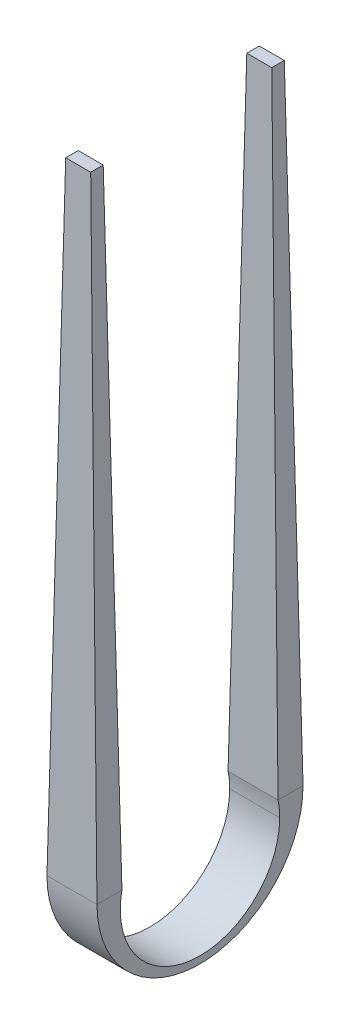
ISO-10303-21;
HEADER;
FILE_DESCRIPTION(('STEP AP214'),'2;1');
FILE_NAME('part.step','',(''),(''),'','','');
FILE_SCHEMA(('AUTOMOTIVE_DESIGN { 1 0 10303 214 1 1 1 1 }'));
ENDSEC;
DATA;
#1=APPLICATION_CONTEXT('core data for automotive mechanical design processes');
#2=APPLICATION_PROTOCOL_DEFINITION('international standard','automotive_design',2000,#1);
#3=PRODUCT_CONTEXT('',#1,'mechanical');
#4=PRODUCT('Part','Part','',(#3));
#5=PRODUCT_RELATED_PRODUCT_CATEGORY('part','',(#4));
#6=PRODUCT_DEFINITION_FORMATION('','',#4);
#7=PRODUCT_DEFINITION_CONTEXT('part definition',#1,'design');
#8=PRODUCT_DEFINITION('design','',#6,#7);
#9=PRODUCT_DEFINITION_SHAPE('','',#8);
#10=(LENGTH_UNIT() NAMED_UNIT(*) SI_UNIT(.MILLI.,.METRE.));
#11=(NAMED_UNIT(*) PLANE_ANGLE_UNIT() SI_UNIT($,.RADIAN.));
#12=(NAMED_UNIT(*) SI_UNIT($,.STERADIAN.) SOLID_ANGLE_UNIT());
#13=UNCERTAINTY_MEASURE_WITH_UNIT(LENGTH_MEASURE(1.E-05),#10,'distance_accuracy_value','');
#14=(GEOMETRIC_REPRESENTATION_CONTEXT(3) GLOBAL_UNCERTAINTY_ASSIGNED_CONTEXT((#13)) GLOBAL_UNIT_ASSIGNED_CONTEXT((#10,
#11,#12)) REPRESENTATION_CONTEXT('',''));
#15=CARTESIAN_POINT('',(0.,0.,0.));
#16=DIRECTION('',(0.,0.,1.));
#17=DIRECTION('',(1.,0.,0.));
#18=AXIS2_PLACEMENT_3D('',#15,#16,#17);
#19=CARTESIAN_POINT('',(-499.623511357238,100.779273283845,-175.030369401289));
#20=DIRECTION('',(-0.999800059980007,0.0199960011996001,0.));
#21=DIRECTION('',(0.,0.,1.));
#22=AXIS2_PLACEMENT_3D('',#19,#20,#21);
#23=PLANE('',#22);
#24=CARTESIAN_POINT('',(-499.623511357238,100.779273283845,-179.030369401289));
#25=CARTESIAN_POINT('',(-499.623511357238,100.779273283845,-177.697036067956));
#26=CARTESIAN_POINT('',(-499.623511357238,100.779273283845,-176.363702734623));
#27=CARTESIAN_POINT('',(-499.623511357238,100.779273283845,-175.030369401289));
#28=(BOUNDED_CURVE() B_SPLINE_CURVE(3,(#24,#25,#26,#27),.UNSPECIFIED.,.F.,
.F.) B_SPLINE_CURVE_WITH_KNOTS((4,4),(0.,1.),
.UNSPECIFIED.) CURVE() GEOMETRIC_REPRESENTATION_ITEM() RATIONAL_B_SPLINE_CURVE((1.,1.,1.,1.)) REPRESENTATION_ITEM(''));
#29=CARTESIAN_POINT('',(-499.623511357238,100.779273283845,-179.030369401289));
#30=VERTEX_POINT('',#29);
#31=CARTESIAN_POINT('',(-499.623511357238,100.779273283845,-175.030369401289));
#32=VERTEX_POINT('',#31);
#33=EDGE_CURVE('P0_E72',#30,#32,#28,.T.);
#34=ORIENTED_EDGE('',*,*,#33,.F.);
#35=CARTESIAN_POINT('',(-499.623511357238,100.779273283845,-179.030369401289));
#36=CARTESIAN_POINT('',(-500.956844690571,34.1126066171781,-179.697036067956));
#37=CARTESIAN_POINT('',(-502.290178023905,-32.5540600494886,-180.363702734622));
#38=CARTESIAN_POINT('',(-503.623511357238,-99.2207267161553,-181.030369401289));
#39=(BOUNDED_CURVE() B_SPLINE_CURVE(3,(#35,#36,#37,#38),.UNSPECIFIED.,.F.,
.F.) B_SPLINE_CURVE_WITH_KNOTS((4,4),(0.,1.),
.UNSPECIFIED.) CURVE() GEOMETRIC_REPRESENTATION_ITEM() RATIONAL_B_SPLINE_CURVE((1.,1.,1.,1.)) REPRESENTATION_ITEM(''));
#40=CARTESIAN_POINT('',(-503.623511357238,-99.2207267161553,-181.030369401289));
#41=VERTEX_POINT('',#40);
#42=EDGE_CURVE('P0_E11',#30,#41,#39,.T.);
#43=ORIENTED_EDGE('',*,*,#42,.T.);
#44=CARTESIAN_POINT('',(-503.623511357238,-99.2207267161553,-181.030369401289));
#45=CARTESIAN_POINT('',(-503.623511357238,-99.2207267161553,-178.363702734622));
#46=CARTESIAN_POINT('',(-503.623511357238,-99.2207267161553,-175.697036067956));
#47=CARTESIAN_POINT('',(-503.623511357238,-99.2207267161553,-173.030369401289));
#48=(BOUNDED_CURVE() B_SPLINE_CURVE(3,(#44,#45,#46,#47),.UNSPECIFIED.,.F.,
.F.) B_SPLINE_CURVE_WITH_KNOTS((4,4),(0.,1.),
.UNSPECIFIED.) CURVE() GEOMETRIC_REPRESENTATION_ITEM() RATIONAL_B_SPLINE_CURVE((1.,1.,1.,1.)) REPRESENTATION_ITEM(''));
#49=CARTESIAN_POINT('',(-503.623511357238,-99.2207267161553,-173.030369401289));
#50=VERTEX_POINT('',#49);
#51=EDGE_CURVE('P0_E69',#41,#50,#48,.T.);
#52=ORIENTED_EDGE('',*,*,#51,.T.);
#53=CARTESIAN_POINT('',(-499.623511357238,100.779273283845,-175.030369401289));
#54=CARTESIAN_POINT('',(-500.956844690571,34.1126066171781,-174.363702734623));
#55=CARTESIAN_POINT('',(-502.290178023904,-32.5540600494886,-173.697036067956));
#56=CARTESIAN_POINT('',(-503.623511357238,-99.2207267161553,-173.030369401289));
#57=(BOUNDED_CURVE() B_SPLINE_CURVE(3,(#53,#54,#55,#56),.UNSPECIFIED.,.F.,
.F.) B_SPLINE_CURVE_WITH_KNOTS((4,4),(0.,1.),
.UNSPECIFIED.) CURVE() GEOMETRIC_REPRESENTATION_ITEM() RATIONAL_B_SPLINE_CURVE((1.,1.,1.,1.)) REPRESENTATION_ITEM(''));
#58=EDGE_CURVE('P0_E116',#32,#50,#57,.T.);
#59=ORIENTED_EDGE('',*,*,#58,.F.);
#60=EDGE_LOOP('',(#34,#43,#52,#59));
#61=FACE_BOUND('',#60,.T.);
#62=ADVANCED_FACE('P0_F17',(#61),#23,.T.);
#63=CARTESIAN_POINT('',(-499.623511357238,100.779273283845,-179.030369401289));
#64=DIRECTION('',(0.,0.00999950003749688,-0.999950003749687));
#65=DIRECTION('',(-1.,0.,0.));
#66=AXIS2_PLACEMENT_3D('',#63,#64,#65);
#67=PLANE('',#66);
#68=CARTESIAN_POINT('',(-491.623511357238,100.779273283845,-179.030369401289));
#69=CARTESIAN_POINT('',(-494.290178023905,100.779273283845,-179.030369401289));
#70=CARTESIAN_POINT('',(-496.956844690571,100.779273283845,-179.030369401289));
#71=CARTESIAN_POINT('',(-499.623511357238,100.779273283845,-179.030369401289));
#72=(BOUNDED_CURVE() B_SPLINE_CURVE(3,(#68,#69,#70,#71),.UNSPECIFIED.,.F.,
.F.) B_SPLINE_CURVE_WITH_KNOTS((4,4),(0.,1.),
.UNSPECIFIED.) CURVE() GEOMETRIC_REPRESENTATION_ITEM() RATIONAL_B_SPLINE_CURVE((1.,1.,1.,1.)) REPRESENTATION_ITEM(''));
#73=CARTESIAN_POINT('',(-491.623511357238,100.779273283845,-179.030369401289));
#74=VERTEX_POINT('',#73);
#75=EDGE_CURVE('P0_E97',#74,#30,#72,.T.);
#76=ORIENTED_EDGE('',*,*,#75,.F.);
#77=CARTESIAN_POINT('',(-491.623511357238,100.779273283845,-179.030369401289));
#78=CARTESIAN_POINT('',(-490.290178023905,34.1126066171781,-179.697036067956));
#79=CARTESIAN_POINT('',(-488.956844690571,-32.5540600494886,-180.363702734622));
#80=CARTESIAN_POINT('',(-487.623511357238,-99.2207267161553,-181.030369401289));
#81=(BOUNDED_CURVE() B_SPLINE_CURVE(3,(#77,#78,#79,#80),.UNSPECIFIED.,.F.,
.F.) B_SPLINE_CURVE_WITH_KNOTS((4,4),(0.,1.),
.UNSPECIFIED.) CURVE() GEOMETRIC_REPRESENTATION_ITEM() RATIONAL_B_SPLINE_CURVE((1.,1.,1.,1.)) REPRESENTATION_ITEM(''));
#82=CARTESIAN_POINT('',(-487.623511357238,-99.2207267161553,-181.030369401289));
#83=VERTEX_POINT('',#82);
#84=EDGE_CURVE('P0_E30',#74,#83,#81,.T.);
#85=ORIENTED_EDGE('',*,*,#84,.T.);
#86=CARTESIAN_POINT('',(-487.623511357238,-99.2207267161553,-181.030369401289));
#87=CARTESIAN_POINT('',(-492.956844690571,-99.2207267161553,-181.030369401289));
#88=CARTESIAN_POINT('',(-498.290178023905,-99.2207267161553,-181.030369401289));
#89=CARTESIAN_POINT('',(-503.623511357238,-99.2207267161553,-181.030369401289));
#90=(BOUNDED_CURVE() B_SPLINE_CURVE(3,(#86,#87,#88,#89),.UNSPECIFIED.,.F.,
.F.) B_SPLINE_CURVE_WITH_KNOTS((4,4),(0.,1.),
.UNSPECIFIED.) CURVE() GEOMETRIC_REPRESENTATION_ITEM() RATIONAL_B_SPLINE_CURVE((1.,1.,1.,1.)) REPRESENTATION_ITEM(''));
#91=EDGE_CURVE('P0_E78',#83,#41,#90,.T.);
#92=ORIENTED_EDGE('',*,*,#91,.T.);
#93=ORIENTED_EDGE('',*,*,#42,.F.);
#94=EDGE_LOOP('',(#76,#85,#92,#93));
#95=FACE_BOUND('',#94,.T.);
#96=ADVANCED_FACE('P0_F84',(#95),#67,.T.);
#97=CARTESIAN_POINT('',(-491.623511357238,100.779273283845,-179.030369401289));
#98=DIRECTION('',(0.999800059980007,0.0199960011996003,0.));
#99=DIRECTION('',(0.,-6.96226258464213E-13,-1.));
#100=AXIS2_PLACEMENT_3D('',#97,#98,#99);
#101=PLANE('',#100);
#102=CARTESIAN_POINT('',(-491.623511357238,100.779273283845,-175.030369401289));
#103=CARTESIAN_POINT('',(-491.623511357238,100.779273283845,-176.363702734623));
#104=CARTESIAN_POINT('',(-491.623511357238,100.779273283845,-177.697036067956));
#105=CARTESIAN_POINT('',(-491.623511357238,100.779273283845,-179.030369401289));
#106=(BOUNDED_CURVE() B_SPLINE_CURVE(3,(#102,#103,#104,#105),.UNSPECIFIED.,.F.,
.F.) B_SPLINE_CURVE_WITH_KNOTS((4,4),(0.,1.),
.UNSPECIFIED.) CURVE() GEOMETRIC_REPRESENTATION_ITEM() RATIONAL_B_SPLINE_CURVE((1.,1.,1.,1.)) REPRESENTATION_ITEM(''));
#107=CARTESIAN_POINT('',(-491.623511357238,100.779273283845,-175.030369401289));
#108=VERTEX_POINT('',#107);
#109=EDGE_CURVE('P0_E101',#108,#74,#106,.T.);
#110=ORIENTED_EDGE('',*,*,#109,.F.);
#111=CARTESIAN_POINT('',(-491.623511357238,100.779273283845,-175.030369401289));
#112=CARTESIAN_POINT('',(-490.290178023905,34.1126066171781,-174.363702734623));
#113=CARTESIAN_POINT('',(-488.956844690571,-32.5540600494886,-173.697036067956));
#114=CARTESIAN_POINT('',(-487.623511357238,-99.2207267161553,-173.030369401289));
#115=(BOUNDED_CURVE() B_SPLINE_CURVE(3,(#111,#112,#113,#114),.UNSPECIFIED.,.F.,
.F.) B_SPLINE_CURVE_WITH_KNOTS((4,4),(0.,1.),
.UNSPECIFIED.) CURVE() GEOMETRIC_REPRESENTATION_ITEM() RATIONAL_B_SPLINE_CURVE((1.,1.,1.,1.)) REPRESENTATION_ITEM(''));
#116=CARTESIAN_POINT('',(-487.623511357238,-99.2207267161553,-173.030369401289));
#117=VERTEX_POINT('',#116);
#118=EDGE_CURVE('P0_E141',#108,#117,#115,.T.);
#119=ORIENTED_EDGE('',*,*,#118,.T.);
#120=CARTESIAN_POINT('',(-487.623511357238,-99.2207267161553,-173.030369401289));
#121=CARTESIAN_POINT('',(-487.623511357238,-99.2207267161553,-175.697036067956));
#122=CARTESIAN_POINT('',(-487.623511357238,-99.2207267161553,-178.363702734622));
#123=CARTESIAN_POINT('',(-487.623511357238,-99.2207267161553,-181.030369401289));
#124=(BOUNDED_CURVE() B_SPLINE_CURVE(3,(#120,#121,#122,#123),.UNSPECIFIED.,.F.,
.F.) B_SPLINE_CURVE_WITH_KNOTS((4,4),(0.,1.),
.UNSPECIFIED.) CURVE() GEOMETRIC_REPRESENTATION_ITEM() RATIONAL_B_SPLINE_CURVE((1.,1.,1.,1.)) REPRESENTATION_ITEM(''));
#125=EDGE_CURVE('P0_E21',#117,#83,#124,.T.);
#126=ORIENTED_EDGE('',*,*,#125,.T.);
#127=ORIENTED_EDGE('',*,*,#84,.F.);
#128=EDGE_LOOP('',(#110,#119,#126,#127));
#129=FACE_BOUND('',#128,.T.);
#130=ADVANCED_FACE('P0_F19',(#129),#101,.T.);
#131=CARTESIAN_POINT('',(-491.623511357238,100.779273283845,-175.030369401289));
#132=DIRECTION('',(0.,0.00999950003749688,0.999950003749687));
#133=DIRECTION('',(1.,-1.3923523122973E-12,0.));
#134=AXIS2_PLACEMENT_3D('',#131,#132,#133);
#135=PLANE('',#134);
#136=CARTESIAN_POINT('',(-499.623511357238,100.779273283845,-175.030369401289));
#137=CARTESIAN_POINT('',(-496.956844690571,100.779273283845,-175.030369401289));
#138=CARTESIAN_POINT('',(-494.290178023904,100.779273283845,-175.030369401289));
#139=CARTESIAN_POINT('',(-491.623511357238,100.779273283845,-175.030369401289));
#140=(BOUNDED_CURVE() B_SPLINE_CURVE(3,(#136,#137,#138,#139),.UNSPECIFIED.,.F.,
.F.) B_SPLINE_CURVE_WITH_KNOTS((4,4),(0.,1.),
.UNSPECIFIED.) CURVE() GEOMETRIC_REPRESENTATION_ITEM() RATIONAL_B_SPLINE_CURVE((1.,1.,1.,1.)) REPRESENTATION_ITEM(''));
#141=EDGE_CURVE('P0_E82',#32,#108,#140,.T.);
#142=ORIENTED_EDGE('',*,*,#141,.F.);
#143=ORIENTED_EDGE('',*,*,#58,.T.);
#144=CARTESIAN_POINT('',(-503.623511357238,-99.2207267161553,-173.030369401289));
#145=CARTESIAN_POINT('',(-498.290178023905,-99.2207267161553,-173.030369401289));
#146=CARTESIAN_POINT('',(-492.956844690571,-99.2207267161553,-173.030369401289));
#147=CARTESIAN_POINT('',(-487.623511357238,-99.2207267161553,-173.030369401289));
#148=(BOUNDED_CURVE() B_SPLINE_CURVE(3,(#144,#145,#146,#147),.UNSPECIFIED.,.F.,
.F.) B_SPLINE_CURVE_WITH_KNOTS((4,4),(0.,1.),
.UNSPECIFIED.) CURVE() GEOMETRIC_REPRESENTATION_ITEM() RATIONAL_B_SPLINE_CURVE((1.,1.,1.,1.)) REPRESENTATION_ITEM(''));
#149=EDGE_CURVE('P0_E80',#50,#117,#148,.T.);
#150=ORIENTED_EDGE('',*,*,#149,.T.);
#151=ORIENTED_EDGE('',*,*,#118,.F.);
#152=EDGE_LOOP('',(#142,#143,#150,#151));
#153=FACE_BOUND('',#152,.T.);
#154=ADVANCED_FACE('P0_F173',(#153),#135,.T.);
#155=CARTESIAN_POINT('',(-495.623511357238,100.779273283845,-177.030369401289));
#156=DIRECTION('',(0.,1.,0.));
#157=DIRECTION('',(1.,0.,0.));
#158=AXIS2_PLACEMENT_3D('',#155,#156,#157);
#159=PLANE('',#158);
#160=ORIENTED_EDGE('',*,*,#141,.T.);
#161=ORIENTED_EDGE('',*,*,#109,.T.);
#162=ORIENTED_EDGE('',*,*,#75,.T.);
#163=ORIENTED_EDGE('',*,*,#33,.T.);
#164=EDGE_LOOP('',(#160,#161,#162,#163));
#165=FACE_BOUND('',#164,.T.);
#166=ADVANCED_FACE('P0_F176',(#165),#159,.T.);
#167=CARTESIAN_POINT('',(-495.623511357238,-99.2207267161553,-177.030369401289));
#168=DIRECTION('',(0.,-1.,0.));
#169=DIRECTION('',(0.,0.,-1.));
#170=AXIS2_PLACEMENT_3D('',#167,#168,#169);
#171=PLANE('',#170);
#172=ORIENTED_EDGE('',*,*,#91,.F.);
#173=ORIENTED_EDGE('',*,*,#125,.F.);
#174=ORIENTED_EDGE('',*,*,#149,.F.);
#175=ORIENTED_EDGE('',*,*,#51,.F.);
#176=EDGE_LOOP('',(#172,#173,#174,#175));
#177=FACE_BOUND('',#176,.T.);
#178=ADVANCED_FACE('P0_F76',(#177),#171,.T.);
#179=CLOSED_SHELL('',(#62,#96,#130,#154,#166,#178));
#180=MANIFOLD_SOLID_BREP('P0_B1',#179);
#181=CARTESIAN_POINT('',(-491.623511357237,100.779273283845,-236.994601444059));
#182=DIRECTION('',(0.999800059980007,0.0199960011996002,0.));
#183=DIRECTION('',(0.,-3.49148133884313E-13,-1.));
#184=AXIS2_PLACEMENT_3D('',#181,#182,#183);
#185=PLANE('',#184);
#186=CARTESIAN_POINT('',(-491.623511357237,100.779273283845,-232.994601444059));
#187=CARTESIAN_POINT('',(-491.623511357237,100.779273283845,-234.327934777393));
#188=CARTESIAN_POINT('',(-491.623511357237,100.779273283845,-235.661268110727));
#189=CARTESIAN_POINT('',(-491.623511357237,100.779273283845,-236.994601444059));
#190=(BOUNDED_CURVE() B_SPLINE_CURVE(3,(#186,#187,#188,#189),.UNSPECIFIED.,.F.,
.F.) B_SPLINE_CURVE_WITH_KNOTS((4,4),(0.,1.),
.UNSPECIFIED.) CURVE() GEOMETRIC_REPRESENTATION_ITEM() RATIONAL_B_SPLINE_CURVE((1.,1.,1.,1.)) REPRESENTATION_ITEM(''));
#191=CARTESIAN_POINT('',(-491.623511357237,100.779273283845,-232.994601444059));
#192=VERTEX_POINT('',#191);
#193=CARTESIAN_POINT('',(-491.623511357237,100.779273283845,-236.994601444059));
#194=VERTEX_POINT('',#193);
#195=EDGE_CURVE('P1_E80',#192,#194,#190,.T.);
#196=ORIENTED_EDGE('',*,*,#195,.F.);
#197=CARTESIAN_POINT('',(-491.623511357237,100.779273283845,-232.994601444059));
#198=CARTESIAN_POINT('',(-490.290178023904,34.1126066171781,-232.327934777393));
#199=CARTESIAN_POINT('',(-488.95684469057,-32.5540600494886,-231.661268110727));
#200=CARTESIAN_POINT('',(-487.623511357237,-99.2207267161552,-230.994601444059));
#201=(BOUNDED_CURVE() B_SPLINE_CURVE(3,(#197,#198,#199,#200),.UNSPECIFIED.,.F.,
.F.) B_SPLINE_CURVE_WITH_KNOTS((4,4),(0.,1.),
.UNSPECIFIED.) CURVE() GEOMETRIC_REPRESENTATION_ITEM() RATIONAL_B_SPLINE_CURVE((1.,1.,1.,1.)) REPRESENTATION_ITEM(''));
#202=CARTESIAN_POINT('',(-487.623511357237,-99.2207267161552,-230.994601444059));
#203=VERTEX_POINT('',#202);
#204=EDGE_CURVE('P1_E11',#192,#203,#201,.T.);
#205=ORIENTED_EDGE('',*,*,#204,.T.);
#206=CARTESIAN_POINT('',(-487.623511357237,-99.2207267161552,-230.994601444059));
#207=CARTESIAN_POINT('',(-487.623511357237,-99.2207267161552,-233.661268110727));
#208=CARTESIAN_POINT('',(-487.623511357237,-99.2207267161552,-236.327934777393));
#209=CARTESIAN_POINT('',(-487.623511357237,-99.2207267161552,-238.99460144406));
#210=(BOUNDED_CURVE() B_SPLINE_CURVE(3,(#206,#207,#208,#209),.UNSPECIFIED.,.F.,
.F.) B_SPLINE_CURVE_WITH_KNOTS((4,4),(0.,1.),
.UNSPECIFIED.) CURVE() GEOMETRIC_REPRESENTATION_ITEM() RATIONAL_B_SPLINE_CURVE((1.,1.,1.,1.)) REPRESENTATION_ITEM(''));
#211=CARTESIAN_POINT('',(-487.623511357237,-99.2207267161552,-238.99460144406));
#212=VERTEX_POINT('',#211);
#213=EDGE_CURVE('P1_E83',#203,#212,#210,.T.);
#214=ORIENTED_EDGE('',*,*,#213,.T.);
#215=CARTESIAN_POINT('',(-491.623511357237,100.779273283845,-236.994601444059));
#216=CARTESIAN_POINT('',(-490.290178023904,34.1126066171781,-237.661268110727));
#217=CARTESIAN_POINT('',(-488.956844690571,-32.5540600494886,-238.327934777393));
#218=CARTESIAN_POINT('',(-487.623511357237,-99.2207267161552,-238.99460144406));
#219=(BOUNDED_CURVE() B_SPLINE_CURVE(3,(#215,#216,#217,#218),.UNSPECIFIED.,.F.,
.F.) B_SPLINE_CURVE_WITH_KNOTS((4,4),(0.,1.),
.UNSPECIFIED.) CURVE() GEOMETRIC_REPRESENTATION_ITEM() RATIONAL_B_SPLINE_CURVE((1.,1.,1.,1.)) REPRESENTATION_ITEM(''));
#220=EDGE_CURVE('P1_E67',#194,#212,#219,.T.);
#221=ORIENTED_EDGE('',*,*,#220,.F.);
#222=EDGE_LOOP('',(#196,#205,#214,#221));
#223=FACE_BOUND('',#222,.T.);
#224=ADVANCED_FACE('P1_F17',(#223),#185,.T.);
#225=CARTESIAN_POINT('',(-491.623511357237,100.779273283845,-232.994601444059));
#226=DIRECTION('',(0.,0.00999950003749688,0.999950003749687));
#227=DIRECTION('',(1.,-6.98296267768627E-13,0.));
#228=AXIS2_PLACEMENT_3D('',#225,#226,#227);
#229=PLANE('',#228);
#230=CARTESIAN_POINT('',(-499.623511357237,100.779273283845,-232.994601444059));
#231=CARTESIAN_POINT('',(-496.956844690571,100.779273283845,-232.994601444059));
#232=CARTESIAN_POINT('',(-494.290178023904,100.779273283845,-232.994601444059));
#233=CARTESIAN_POINT('',(-491.623511357237,100.779273283845,-232.994601444059));
#234=(BOUNDED_CURVE() B_SPLINE_CURVE(3,(#230,#231,#232,#233),.UNSPECIFIED.,.F.,
.F.) B_SPLINE_CURVE_WITH_KNOTS((4,4),(0.,1.),
.UNSPECIFIED.) CURVE() GEOMETRIC_REPRESENTATION_ITEM() RATIONAL_B_SPLINE_CURVE((1.,1.,1.,1.)) REPRESENTATION_ITEM(''));
#235=CARTESIAN_POINT('',(-499.623511357237,100.779273283845,-232.994601444059));
#236=VERTEX_POINT('',#235);
#237=EDGE_CURVE('P1_E104',#236,#192,#234,.T.);
#238=ORIENTED_EDGE('',*,*,#237,.F.);
#239=CARTESIAN_POINT('',(-499.623511357237,100.779273283845,-232.994601444059));
#240=CARTESIAN_POINT('',(-500.95684469057,34.1126066171781,-232.327934777393));
#241=CARTESIAN_POINT('',(-502.290178023904,-32.5540600494886,-231.661268110727));
#242=CARTESIAN_POINT('',(-503.623511357237,-99.2207267161552,-230.994601444059));
#243=(BOUNDED_CURVE() B_SPLINE_CURVE(3,(#239,#240,#241,#242),.UNSPECIFIED.,.F.,
.F.) B_SPLINE_CURVE_WITH_KNOTS((4,4),(0.,1.),
.UNSPECIFIED.) CURVE() GEOMETRIC_REPRESENTATION_ITEM() RATIONAL_B_SPLINE_CURVE((1.,1.,1.,1.)) REPRESENTATION_ITEM(''));
#244=CARTESIAN_POINT('',(-503.623511357237,-99.2207267161552,-230.994601444059));
#245=VERTEX_POINT('',#244);
#246=EDGE_CURVE('P1_E21',#236,#245,#243,.T.);
#247=ORIENTED_EDGE('',*,*,#246,.T.);
#248=CARTESIAN_POINT('',(-503.623511357237,-99.2207267161552,-230.994601444059));
#249=CARTESIAN_POINT('',(-498.290178023904,-99.2207267161553,-230.994601444059));
#250=CARTESIAN_POINT('',(-492.956844690571,-99.2207267161553,-230.994601444059));
#251=CARTESIAN_POINT('',(-487.623511357237,-99.2207267161552,-230.994601444059));
#252=(BOUNDED_CURVE() B_SPLINE_CURVE(3,(#248,#249,#250,#251),.UNSPECIFIED.,.F.,
.F.) B_SPLINE_CURVE_WITH_KNOTS((4,4),(0.,1.),
.UNSPECIFIED.) CURVE() GEOMETRIC_REPRESENTATION_ITEM() RATIONAL_B_SPLINE_CURVE((1.,1.,1.,1.)) REPRESENTATION_ITEM(''));
#253=EDGE_CURVE('P1_E98',#245,#203,#252,.T.);
#254=ORIENTED_EDGE('',*,*,#253,.T.);
#255=ORIENTED_EDGE('',*,*,#204,.F.);
#256=EDGE_LOOP('',(#238,#247,#254,#255));
#257=FACE_BOUND('',#256,.T.);
#258=ADVANCED_FACE('P1_F156',(#257),#229,.T.);
#259=CARTESIAN_POINT('',(-499.623511357237,100.779273283845,-232.994601444059));
#260=DIRECTION('',(-0.999800059980007,0.0199960011996002,0.));
#261=DIRECTION('',(0.,0.,1.));
#262=AXIS2_PLACEMENT_3D('',#259,#260,#261);
#263=PLANE('',#262);
#264=CARTESIAN_POINT('',(-499.623511357237,100.779273283845,-236.994601444059));
#265=CARTESIAN_POINT('',(-499.623511357237,100.779273283845,-235.661268110727));
#266=CARTESIAN_POINT('',(-499.623511357237,100.779273283845,-234.327934777393));
#267=CARTESIAN_POINT('',(-499.623511357237,100.779273283845,-232.994601444059));
#268=(BOUNDED_CURVE() B_SPLINE_CURVE(3,(#264,#265,#266,#267),.UNSPECIFIED.,.F.,
.F.) B_SPLINE_CURVE_WITH_KNOTS((4,4),(0.,1.),
.UNSPECIFIED.) CURVE() GEOMETRIC_REPRESENTATION_ITEM() RATIONAL_B_SPLINE_CURVE((1.,1.,1.,1.)) REPRESENTATION_ITEM(''));
#269=CARTESIAN_POINT('',(-499.623511357237,100.779273283845,-236.994601444059));
#270=VERTEX_POINT('',#269);
#271=EDGE_CURVE('P1_E113',#270,#236,#268,.T.);
#272=ORIENTED_EDGE('',*,*,#271,.F.);
#273=CARTESIAN_POINT('',(-499.623511357237,100.779273283845,-236.994601444059));
#274=CARTESIAN_POINT('',(-500.95684469057,34.1126066171781,-237.661268110727));
#275=CARTESIAN_POINT('',(-502.290178023904,-32.5540600494886,-238.327934777393));
#276=CARTESIAN_POINT('',(-503.623511357237,-99.2207267161552,-238.99460144406));
#277=(BOUNDED_CURVE() B_SPLINE_CURVE(3,(#273,#274,#275,#276),.UNSPECIFIED.,.F.,
.F.) B_SPLINE_CURVE_WITH_KNOTS((4,4),(0.,1.),
.UNSPECIFIED.) CURVE() GEOMETRIC_REPRESENTATION_ITEM() RATIONAL_B_SPLINE_CURVE((1.,1.,1.,1.)) REPRESENTATION_ITEM(''));
#278=CARTESIAN_POINT('',(-503.623511357237,-99.2207267161552,-238.99460144406));
#279=VERTEX_POINT('',#278);
#280=EDGE_CURVE('P1_E79',#270,#279,#277,.T.);
#281=ORIENTED_EDGE('',*,*,#280,.T.);
#282=CARTESIAN_POINT('',(-503.623511357237,-99.2207267161552,-238.99460144406));
#283=CARTESIAN_POINT('',(-503.623511357237,-99.2207267161552,-236.327934777393));
#284=CARTESIAN_POINT('',(-503.623511357237,-99.2207267161552,-233.661268110727));
#285=CARTESIAN_POINT('',(-503.623511357237,-99.2207267161552,-230.994601444059));
#286=(BOUNDED_CURVE() B_SPLINE_CURVE(3,(#282,#283,#284,#285),.UNSPECIFIED.,.F.,
.F.) B_SPLINE_CURVE_WITH_KNOTS((4,4),(0.,1.),
.UNSPECIFIED.) CURVE() GEOMETRIC_REPRESENTATION_ITEM() RATIONAL_B_SPLINE_CURVE((1.,1.,1.,1.)) REPRESENTATION_ITEM(''));
#287=EDGE_CURVE('P1_E90',#279,#245,#286,.T.);
#288=ORIENTED_EDGE('',*,*,#287,.T.);
#289=ORIENTED_EDGE('',*,*,#246,.F.);
#290=EDGE_LOOP('',(#272,#281,#288,#289));
#291=FACE_BOUND('',#290,.T.);
#292=ADVANCED_FACE('P1_F158',(#291),#263,.T.);
#293=CARTESIAN_POINT('',(-499.623511357237,100.779273283845,-236.994601444059));
#294=DIRECTION('',(0.,0.00999950003749688,-0.999950003749687));
#295=DIRECTION('',(-1.,0.,0.));
#296=AXIS2_PLACEMENT_3D('',#293,#294,#295);
#297=PLANE('',#296);
#298=CARTESIAN_POINT('',(-491.623511357237,100.779273283845,-236.994601444059));
#299=CARTESIAN_POINT('',(-494.290178023904,100.779273283845,-236.994601444059));
#300=CARTESIAN_POINT('',(-496.956844690571,100.779273283845,-236.994601444059));
#301=CARTESIAN_POINT('',(-499.623511357237,100.779273283845,-236.994601444059));
#302=(BOUNDED_CURVE() B_SPLINE_CURVE(3,(#298,#299,#300,#301),.UNSPECIFIED.,.F.,
.F.) B_SPLINE_CURVE_WITH_KNOTS((4,4),(0.,1.),
.UNSPECIFIED.) CURVE() GEOMETRIC_REPRESENTATION_ITEM() RATIONAL_B_SPLINE_CURVE((1.,1.,1.,1.)) REPRESENTATION_ITEM(''));
#303=EDGE_CURVE('P1_E75',#194,#270,#302,.T.);
#304=ORIENTED_EDGE('',*,*,#303,.F.);
#305=ORIENTED_EDGE('',*,*,#220,.T.);
#306=CARTESIAN_POINT('',(-487.623511357237,-99.2207267161552,-238.99460144406));
#307=CARTESIAN_POINT('',(-492.956844690571,-99.2207267161553,-238.99460144406));
#308=CARTESIAN_POINT('',(-498.290178023904,-99.2207267161553,-238.99460144406));
#309=CARTESIAN_POINT('',(-503.623511357237,-99.2207267161552,-238.99460144406));
#310=(BOUNDED_CURVE() B_SPLINE_CURVE(3,(#306,#307,#308,#309),.UNSPECIFIED.,.F.,
.F.) B_SPLINE_CURVE_WITH_KNOTS((4,4),(0.,1.),
.UNSPECIFIED.) CURVE() GEOMETRIC_REPRESENTATION_ITEM() RATIONAL_B_SPLINE_CURVE((1.,1.,1.,1.)) REPRESENTATION_ITEM(''));
#311=EDGE_CURVE('P1_E72',#212,#279,#310,.T.);
#312=ORIENTED_EDGE('',*,*,#311,.T.);
#313=ORIENTED_EDGE('',*,*,#280,.F.);
#314=EDGE_LOOP('',(#304,#305,#312,#313));
#315=FACE_BOUND('',#314,.T.);
#316=ADVANCED_FACE('P1_F69',(#315),#297,.T.);
#317=CARTESIAN_POINT('',(-495.623511357237,100.779273283845,-234.994601444059));
#318=DIRECTION('',(0.,1.,0.));
#319=DIRECTION('',(1.,0.,0.));
#320=AXIS2_PLACEMENT_3D('',#317,#318,#319);
#321=PLANE('',#320);
#322=ORIENTED_EDGE('',*,*,#303,.T.);
#323=ORIENTED_EDGE('',*,*,#271,.T.);
#324=ORIENTED_EDGE('',*,*,#237,.T.);
#325=ORIENTED_EDGE('',*,*,#195,.T.);
#326=EDGE_LOOP('',(#322,#323,#324,#325));
#327=FACE_BOUND('',#326,.T.);
#328=ADVANCED_FACE('P1_F19',(#327),#321,.T.);
#329=CARTESIAN_POINT('',(-495.623511357237,-99.2207267161552,-234.994601444059));
#330=DIRECTION('',(0.,-1.,0.));
#331=DIRECTION('',(0.,0.,-1.));
#332=AXIS2_PLACEMENT_3D('',#329,#330,#331);
#333=PLANE('',#332);
#334=ORIENTED_EDGE('',*,*,#253,.F.);
#335=ORIENTED_EDGE('',*,*,#287,.F.);
#336=ORIENTED_EDGE('',*,*,#311,.F.);
#337=ORIENTED_EDGE('',*,*,#213,.F.);
#338=EDGE_LOOP('',(#334,#335,#336,#337));
#339=FACE_BOUND('',#338,.T.);
#340=ADVANCED_FACE('P1_F88',(#339),#333,.T.);
#341=CLOSED_SHELL('',(#224,#258,#292,#316,#328,#340));
#342=MANIFOLD_SOLID_BREP('P1_B1',#341);
#343=CARTESIAN_POINT('',(-503.623511357237,395.59718436808,-247.928630501101));
#344=DIRECTION('',(1.,0.,0.));
#345=DIRECTION('',(0.,0.,-1.));
#346=AXIS2_PLACEMENT_3D('',#343,#344,#345);
#347=PLANE('',#346);
#348=DIRECTION('',(0.,0.,-1.));
#349=VECTOR('',#348,1.);
#350=CARTESIAN_POINT('',(-503.623511357237,-99.2207267161553,-247.928630501101));
#351=LINE('',#350,#349);
#352=CARTESIAN_POINT('',(-503.623511357237,-99.2207267161552,-173.030369401292));
#353=VERTEX_POINT('',#352);
#354=CARTESIAN_POINT('',(-503.623511357237,-99.2207267161553,-181.030369401289));
#355=VERTEX_POINT('',#354);
#356=EDGE_CURVE('P2_E105',#353,#355,#351,.T.);
#357=ORIENTED_EDGE('',*,*,#356,.T.);
#358=CARTESIAN_POINT('',(-503.623511357237,-104.419504194432,-206.012485422675));
#359=DIRECTION('',(1.,0.,0.));
#360=DIRECTION('',(0.,0.,-1.));
#361=AXIS2_PLACEMENT_3D('',#358,#359,#360);
#362=CIRCLE('',#361,25.5173158497243);
#363=CARTESIAN_POINT('',(-503.623511357237,-104.419504194432,-180.49516957295));
#364=VERTEX_POINT('',#363);
#365=EDGE_CURVE('P2_E133',#355,#364,#362,.T.);
#366=ORIENTED_EDGE('',*,*,#365,.T.);
#367=CARTESIAN_POINT('',(-503.623511357237,-104.419504194432,-206.012485422675));
#368=DIRECTION('',(1.,0.,0.));
#369=DIRECTION('',(0.,0.,-1.));
#370=AXIS2_PLACEMENT_3D('',#367,#368,#369);
#371=CIRCLE('',#370,25.5173158497243);
#372=CARTESIAN_POINT('',(-503.623511357237,-104.419504194432,-231.529801272398));
#373=VERTEX_POINT('',#372);
#374=EDGE_CURVE('P2_E120',#364,#373,#371,.T.);
#375=ORIENTED_EDGE('',*,*,#374,.T.);
#376=CARTESIAN_POINT('',(-503.623511357237,-104.419504194432,-206.012485422675));
#377=DIRECTION('',(1.,0.,0.));
#378=DIRECTION('',(0.,0.,-1.));
#379=AXIS2_PLACEMENT_3D('',#376,#377,#378);
#380=CIRCLE('',#379,25.5173158497243);
#381=CARTESIAN_POINT('',(-503.623511357237,-99.2207267161553,-230.994601444059));
#382=VERTEX_POINT('',#381);
#383=EDGE_CURVE('P2_E10',#373,#382,#380,.T.);
#384=ORIENTED_EDGE('',*,*,#383,.T.);
#385=DIRECTION('',(0.,0.,-1.));
#386=VECTOR('',#385,1.);
#387=CARTESIAN_POINT('',(-503.623511357237,-99.2207267161553,-247.928630501101));
#388=LINE('',#387,#386);
#389=CARTESIAN_POINT('',(-503.623511357237,-99.2207267161552,-238.99460144406));
#390=VERTEX_POINT('',#389);
#391=EDGE_CURVE('P2_E72',#382,#390,#388,.T.);
#392=ORIENTED_EDGE('',*,*,#391,.T.);
#393=CARTESIAN_POINT('',(-503.623511357237,-99.2207267161552,-206.012485422676));
#394=DIRECTION('',(1.,0.,0.));
#395=DIRECTION('',(0.,0.,-1.));
#396=AXIS2_PLACEMENT_3D('',#393,#394,#395);
#397=CIRCLE('',#396,32.9821160213835);
#398=EDGE_CURVE('P2_E75',#353,#390,#397,.T.);
#399=ORIENTED_EDGE('',*,*,#398,.F.);
#400=EDGE_LOOP('',(#357,#366,#375,#384,#392,#399));
#401=FACE_BOUND('',#400,.T.);
#402=ADVANCED_FACE('P2_F16',(#401),#347,.F.);
#403=CARTESIAN_POINT('',(-487.623511357237,395.59718436808,-247.928630501101));
#404=DIRECTION('',(1.,0.,0.));
#405=DIRECTION('',(0.,0.,-1.));
#406=AXIS2_PLACEMENT_3D('',#403,#404,#405);
#407=PLANE('',#406);
#408=DIRECTION('',(0.,0.,-1.));
#409=VECTOR('',#408,1.);
#410=CARTESIAN_POINT('',(-487.623511357237,-99.2207267161553,-247.928630501101));
#411=LINE('',#410,#409);
#412=CARTESIAN_POINT('',(-487.623511357237,-99.2207267161552,-173.030369401292));
#413=VERTEX_POINT('',#412);
#414=CARTESIAN_POINT('',(-487.623511357237,-99.2207267161553,-181.030369401289));
#415=VERTEX_POINT('',#414);
#416=EDGE_CURVE('P2_E97',#413,#415,#411,.T.);
#417=ORIENTED_EDGE('',*,*,#416,.F.);
#418=CARTESIAN_POINT('',(-487.623511357237,-99.2207267161552,-206.012485422676));
#419=DIRECTION('',(1.,0.,0.));
#420=DIRECTION('',(0.,0.,-1.));
#421=AXIS2_PLACEMENT_3D('',#418,#419,#420);
#422=CIRCLE('',#421,32.9821160213835);
#423=CARTESIAN_POINT('',(-487.623511357237,-99.2207267161552,-238.99460144406));
#424=VERTEX_POINT('',#423);
#425=EDGE_CURVE('P2_E82',#413,#424,#422,.T.);
#426=ORIENTED_EDGE('',*,*,#425,.T.);
#427=DIRECTION('',(0.,0.,-1.));
#428=VECTOR('',#427,1.);
#429=CARTESIAN_POINT('',(-487.623511357237,-99.2207267161553,-247.928630501101));
#430=LINE('',#429,#428);
#431=CARTESIAN_POINT('',(-487.623511357237,-99.2207267161553,-230.994601444059));
#432=VERTEX_POINT('',#431);
#433=EDGE_CURVE('P2_E87',#432,#424,#430,.T.);
#434=ORIENTED_EDGE('',*,*,#433,.F.);
#435=CARTESIAN_POINT('',(-487.623511357237,-104.419504194432,-206.012485422675));
#436=DIRECTION('',(1.,0.,0.));
#437=DIRECTION('',(0.,0.,-1.));
#438=AXIS2_PLACEMENT_3D('',#435,#436,#437);
#439=CIRCLE('',#438,25.5173158497243);
#440=CARTESIAN_POINT('',(-487.623511357237,-104.419504194432,-231.529801272399));
#441=VERTEX_POINT('',#440);
#442=EDGE_CURVE('P2_E25',#441,#432,#439,.T.);
#443=ORIENTED_EDGE('',*,*,#442,.F.);
#444=CARTESIAN_POINT('',(-487.623511357237,-104.419504194432,-206.012485422675));
#445=DIRECTION('',(1.,0.,0.));
#446=DIRECTION('',(0.,0.,-1.));
#447=AXIS2_PLACEMENT_3D('',#444,#445,#446);
#448=CIRCLE('',#447,25.5173158497243);
#449=CARTESIAN_POINT('',(-487.623511357237,-104.419504194432,-180.49516957295));
#450=VERTEX_POINT('',#449);
#451=EDGE_CURVE('P2_E108',#450,#441,#448,.T.);
#452=ORIENTED_EDGE('',*,*,#451,.F.);
#453=CARTESIAN_POINT('',(-487.623511357237,-104.419504194432,-206.012485422675));
#454=DIRECTION('',(1.,0.,0.));
#455=DIRECTION('',(0.,0.,-1.));
#456=AXIS2_PLACEMENT_3D('',#453,#454,#455);
#457=CIRCLE('',#456,25.5173158497243);
#458=EDGE_CURVE('P2_E119',#415,#450,#457,.T.);
#459=ORIENTED_EDGE('',*,*,#458,.F.);
#460=EDGE_LOOP('',(#417,#426,#434,#443,#452,#459));
#461=FACE_BOUND('',#460,.T.);
#462=ADVANCED_FACE('P2_F169',(#461),#407,.T.);
#463=CARTESIAN_POINT('',(-487.623511357237,-104.419504194432,-206.012485422675));
#464=DIRECTION('',(-1.,0.,0.));
#465=DIRECTION('',(0.,0.,1.));
#466=AXIS2_PLACEMENT_3D('',#463,#464,#465);
#467=CYLINDRICAL_SURFACE('',#466,25.5173158497243);
#468=DIRECTION('',(-1.,0.,0.));
#469=VECTOR('',#468,1.);
#470=CARTESIAN_POINT('',(-487.623511357237,-104.419504194432,-231.529801272399));
#471=LINE('',#470,#469);
#472=EDGE_CURVE('P2_E111',#441,#373,#471,.T.);
#473=ORIENTED_EDGE('',*,*,#472,.F.);
#474=ORIENTED_EDGE('',*,*,#442,.T.);
#475=DIRECTION('',(-1.,0.,0.));
#476=VECTOR('',#475,1.);
#477=CARTESIAN_POINT('',(-487.623511357237,-99.2207267161553,-230.994601444059));
#478=LINE('',#477,#476);
#479=EDGE_CURVE('P2_E81',#432,#382,#478,.T.);
#480=ORIENTED_EDGE('',*,*,#479,.T.);
#481=ORIENTED_EDGE('',*,*,#383,.F.);
#482=EDGE_LOOP('',(#473,#474,#480,#481));
#483=FACE_BOUND('',#482,.T.);
#484=ADVANCED_FACE('P2_F170',(#483),#467,.F.);
#485=CARTESIAN_POINT('',(-487.623511357237,-99.2207267161553,-247.928630501101));
#486=DIRECTION('',(0.,1.,0.));
#487=DIRECTION('',(1.,0.,0.));
#488=AXIS2_PLACEMENT_3D('',#485,#486,#487);
#489=PLANE('',#488);
#490=ORIENTED_EDGE('',*,*,#391,.F.);
#491=ORIENTED_EDGE('',*,*,#479,.F.);
#492=ORIENTED_EDGE('',*,*,#433,.T.);
#493=DIRECTION('',(-1.,0.,0.));
#494=VECTOR('',#493,1.);
#495=CARTESIAN_POINT('',(-487.623511357237,-99.2207267161552,-238.99460144406));
#496=LINE('',#495,#494);
#497=EDGE_CURVE('P2_E85',#424,#390,#496,.T.);
#498=ORIENTED_EDGE('',*,*,#497,.T.);
#499=EDGE_LOOP('',(#490,#491,#492,#498));
#500=FACE_BOUND('',#499,.T.);
#501=ADVANCED_FACE('P2_F86',(#500),#489,.T.);
#502=CARTESIAN_POINT('',(-487.623511357237,-99.2207267161552,-206.012485422676));
#503=DIRECTION('',(-1.,0.,0.));
#504=DIRECTION('',(0.,0.,1.));
#505=AXIS2_PLACEMENT_3D('',#502,#503,#504);
#506=CYLINDRICAL_SURFACE('',#505,32.9821160213835);
#507=ORIENTED_EDGE('',*,*,#398,.T.);
#508=ORIENTED_EDGE('',*,*,#497,.F.);
#509=ORIENTED_EDGE('',*,*,#425,.F.);
#510=DIRECTION('',(-1.,0.,0.));
#511=VECTOR('',#510,1.);
#512=CARTESIAN_POINT('',(-487.623511357237,-99.2207267161552,-173.030369401292));
#513=LINE('',#512,#511);
#514=EDGE_CURVE('P2_E94',#413,#353,#513,.T.);
#515=ORIENTED_EDGE('',*,*,#514,.T.);
#516=EDGE_LOOP('',(#507,#508,#509,#515));
#517=FACE_BOUND('',#516,.T.);
#518=ADVANCED_FACE('P2_F92',(#517),#506,.T.);
#519=CARTESIAN_POINT('',(-487.623511357237,-99.2207267161553,-247.928630501101));
#520=DIRECTION('',(0.,1.,0.));
#521=DIRECTION('',(1.,0.,0.));
#522=AXIS2_PLACEMENT_3D('',#519,#520,#521);
#523=PLANE('',#522);
#524=ORIENTED_EDGE('',*,*,#356,.F.);
#525=ORIENTED_EDGE('',*,*,#514,.F.);
#526=ORIENTED_EDGE('',*,*,#416,.T.);
#527=DIRECTION('',(-1.,0.,0.));
#528=VECTOR('',#527,1.);
#529=CARTESIAN_POINT('',(-487.623511357237,-99.2207267161553,-181.030369401289));
#530=LINE('',#529,#528);
#531=EDGE_CURVE('P2_E136',#415,#355,#530,.T.);
#532=ORIENTED_EDGE('',*,*,#531,.T.);
#533=EDGE_LOOP('',(#524,#525,#526,#532));
#534=FACE_BOUND('',#533,.T.);
#535=ADVANCED_FACE('P2_F147',(#534),#523,.T.);
#536=CARTESIAN_POINT('',(-487.623511357237,-104.419504194432,-206.012485422675));
#537=DIRECTION('',(-1.,0.,0.));
#538=DIRECTION('',(0.,0.,1.));
#539=AXIS2_PLACEMENT_3D('',#536,#537,#538);
#540=CYLINDRICAL_SURFACE('',#539,25.5173158497243);
#541=ORIENTED_EDGE('',*,*,#458,.T.);
#542=DIRECTION('',(-1.,0.,0.));
#543=VECTOR('',#542,1.);
#544=CARTESIAN_POINT('',(-487.623511357237,-104.419504194432,-180.49516957295));
#545=LINE('',#544,#543);
#546=EDGE_CURVE('P2_E115',#450,#364,#545,.T.);
#547=ORIENTED_EDGE('',*,*,#546,.T.);
#548=ORIENTED_EDGE('',*,*,#365,.F.);
#549=ORIENTED_EDGE('',*,*,#531,.F.);
#550=EDGE_LOOP('',(#541,#547,#548,#549));
#551=FACE_BOUND('',#550,.T.);
#552=ADVANCED_FACE('P2_F162',(#551),#540,.F.);
#553=CARTESIAN_POINT('',(-487.623511357237,-104.419504194432,-206.012485422675));
#554=DIRECTION('',(-1.,0.,0.));
#555=DIRECTION('',(0.,0.,1.));
#556=AXIS2_PLACEMENT_3D('',#553,#554,#555);
#557=CYLINDRICAL_SURFACE('',#556,25.5173158497243);
#558=ORIENTED_EDGE('',*,*,#451,.T.);
#559=ORIENTED_EDGE('',*,*,#472,.T.);
#560=ORIENTED_EDGE('',*,*,#374,.F.);
#561=ORIENTED_EDGE('',*,*,#546,.F.);
#562=EDGE_LOOP('',(#558,#559,#560,#561));
#563=FACE_BOUND('',#562,.T.);
#564=ADVANCED_FACE('P2_F168',(#563),#557,.F.);
#565=CLOSED_SHELL('',(#402,#462,#484,#501,#518,#535,#552,#564));
#566=MANIFOLD_SOLID_BREP('P2_B1',#565);
#567=ADVANCED_BREP_SHAPE_REPRESENTATION('',(#18,#180,#342,#566),#14);
#568=SHAPE_DEFINITION_REPRESENTATION(#9,#567);
ENDSEC;
END-ISO-10303-21;
